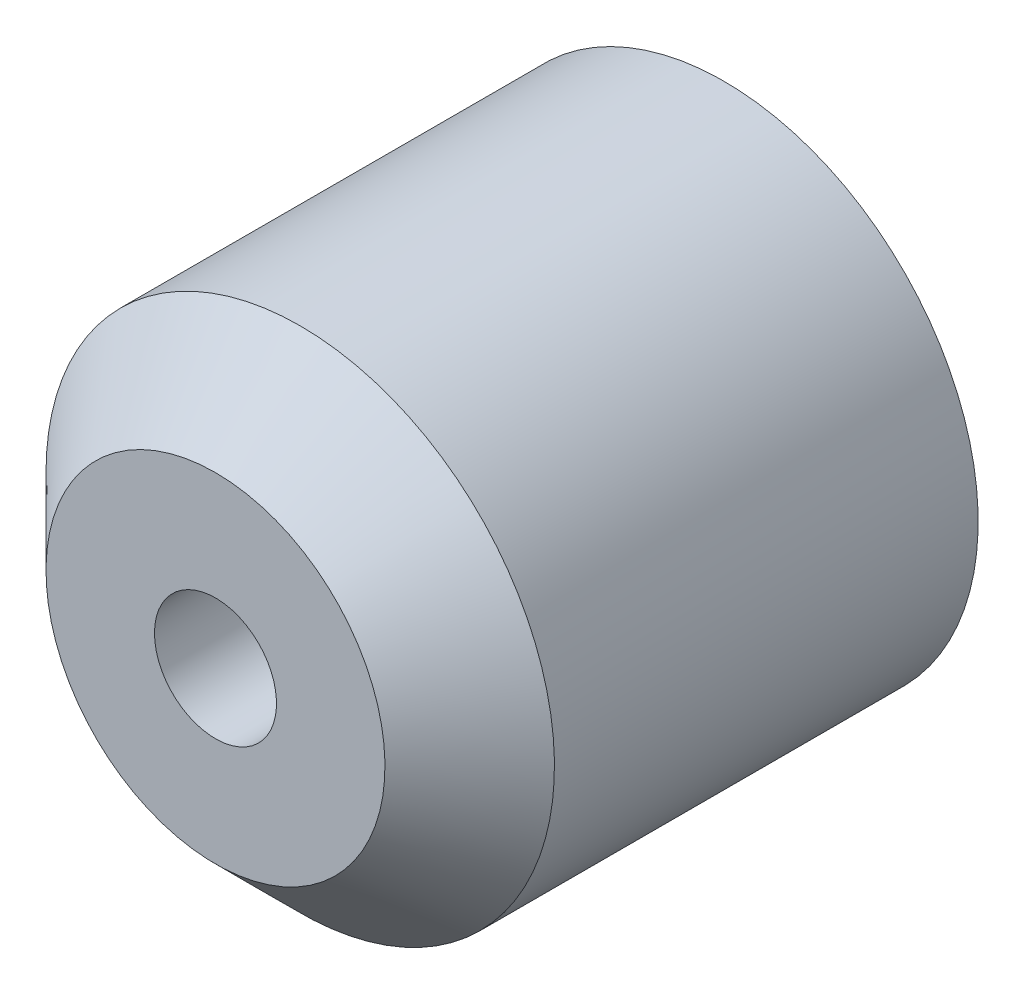
ISO-10303-21;
HEADER;
FILE_DESCRIPTION(('STEP AP214'),'2;1');
FILE_NAME('part.step','',(''),(''),'','','');
FILE_SCHEMA(('AUTOMOTIVE_DESIGN { 1 0 10303 214 1 1 1 1 }'));
ENDSEC;
DATA;
#1=APPLICATION_CONTEXT('core data for automotive mechanical design processes');
#2=APPLICATION_PROTOCOL_DEFINITION('international standard','automotive_design',2000,#1);
#3=PRODUCT_CONTEXT('',#1,'mechanical');
#4=PRODUCT('Part','Part','',(#3));
#5=PRODUCT_RELATED_PRODUCT_CATEGORY('part','',(#4));
#6=PRODUCT_DEFINITION_FORMATION('','',#4);
#7=PRODUCT_DEFINITION_CONTEXT('part definition',#1,'design');
#8=PRODUCT_DEFINITION('design','',#6,#7);
#9=PRODUCT_DEFINITION_SHAPE('','',#8);
#10=(LENGTH_UNIT() NAMED_UNIT(*) SI_UNIT(.MILLI.,.METRE.));
#11=(NAMED_UNIT(*) PLANE_ANGLE_UNIT() SI_UNIT($,.RADIAN.));
#12=(NAMED_UNIT(*) SI_UNIT($,.STERADIAN.) SOLID_ANGLE_UNIT());
#13=UNCERTAINTY_MEASURE_WITH_UNIT(LENGTH_MEASURE(1.E-05),#10,'distance_accuracy_value','');
#14=(GEOMETRIC_REPRESENTATION_CONTEXT(3) GLOBAL_UNCERTAINTY_ASSIGNED_CONTEXT((#13)) GLOBAL_UNIT_ASSIGNED_CONTEXT((#10,
#11,#12)) REPRESENTATION_CONTEXT('',''));
#15=CARTESIAN_POINT('',(0.,0.,0.));
#16=DIRECTION('',(0.,0.,1.));
#17=DIRECTION('',(1.,0.,0.));
#18=AXIS2_PLACEMENT_3D('',#15,#16,#17);
#19=CARTESIAN_POINT('',(0.,0.,0.));
#20=DIRECTION('',(0.,0.,-1.));
#21=DIRECTION('',(-1.,0.,0.));
#22=AXIS2_PLACEMENT_3D('',#19,#20,#21);
#23=CYLINDRICAL_SURFACE('',#22,2.286);
#24=CARTESIAN_POINT('',(0.,0.,0.));
#25=DIRECTION('',(0.,0.,-1.));
#26=DIRECTION('',(-1.,0.,0.));
#27=AXIS2_PLACEMENT_3D('',#24,#25,#26);
#28=CIRCLE('',#27,2.286);
#29=CARTESIAN_POINT('',(-2.286,0.,0.));
#30=VERTEX_POINT('',#29);
#31=EDGE_CURVE('E17',#30,#30,#28,.F.);
#32=ORIENTED_EDGE('',*,*,#31,.T.);
#33=EDGE_LOOP('',(#32));
#34=FACE_BOUND('',#33,.T.);
#35=CARTESIAN_POINT('',(0.,0.,-16.2052000001154));
#36=DIRECTION('',(0.,0.,-1.));
#37=DIRECTION('',(-1.,0.,0.));
#38=AXIS2_PLACEMENT_3D('',#35,#36,#37);
#39=CIRCLE('',#38,2.28600000002643);
#40=CARTESIAN_POINT('',(-2.28600000002643,0.,-16.2052000001154));
#41=VERTEX_POINT('',#40);
#42=EDGE_CURVE('E31',#41,#41,#39,.T.);
#43=ORIENTED_EDGE('',*,*,#42,.T.);
#44=EDGE_LOOP('',(#43));
#45=FACE_BOUND('',#44,.T.);
#46=ADVANCED_FACE('F14',(#34,#45),#23,.F.);
#47=CARTESIAN_POINT('',(0.,0.,-19.0499999999361));
#48=DIRECTION('',(0.,0.,-1.));
#49=DIRECTION('',(-1.,0.,0.));
#50=AXIS2_PLACEMENT_3D('',#47,#48,#49);
#51=CONICAL_SURFACE('',#50,4.55929999992577,0.67419627997474);
#52=CARTESIAN_POINT('',(0.,0.,-19.0499999999361));
#53=DIRECTION('',(0.,0.,-1.));
#54=DIRECTION('',(-1.,0.,0.));
#55=AXIS2_PLACEMENT_3D('',#52,#53,#54);
#56=CIRCLE('',#55,4.55929999992577);
#57=CARTESIAN_POINT('',(-4.55929999992577,0.,-19.0499999999361));
#58=VERTEX_POINT('',#57);
#59=EDGE_CURVE('E37',#58,#58,#56,.F.);
#60=ORIENTED_EDGE('',*,*,#59,.F.);
#61=EDGE_LOOP('',(#60));
#62=FACE_BOUND('',#61,.T.);
#63=ORIENTED_EDGE('',*,*,#42,.F.);
#64=EDGE_LOOP('',(#63));
#65=FACE_BOUND('',#64,.T.);
#66=ADVANCED_FACE('F50',(#62,#65),#51,.F.);
#67=CARTESIAN_POINT('',(0.,0.,0.));
#68=DIRECTION('',(0.,0.,-1.));
#69=DIRECTION('',(-1.,0.,0.));
#70=AXIS2_PLACEMENT_3D('',#67,#68,#69);
#71=PLANE('',#70);
#72=ORIENTED_EDGE('',*,*,#31,.F.);
#73=EDGE_LOOP('',(#72));
#74=FACE_BOUND('',#73,.T.);
#75=CARTESIAN_POINT('',(0.,0.,-3.56268833878737E-12));
#76=DIRECTION('',(0.,0.,-1.));
#77=DIRECTION('',(0.,1.,0.));
#78=AXIS2_PLACEMENT_3D('',#75,#76,#77);
#79=CIRCLE('',#78,6.34999999999602);
#80=CARTESIAN_POINT('',(0.,6.34999999999602,-3.5625437784977E-12));
#81=VERTEX_POINT('',#80);
#82=EDGE_CURVE('E26',#81,#81,#79,.T.);
#83=ORIENTED_EDGE('',*,*,#82,.F.);
#84=EDGE_LOOP('',(#83));
#85=FACE_BOUND('',#84,.T.);
#86=ADVANCED_FACE('F46',(#74,#85),#71,.F.);
#87=CARTESIAN_POINT('',(0.,0.,-19.05));
#88=DIRECTION('',(0.,0.,-1.));
#89=DIRECTION('',(-1.,0.,0.));
#90=AXIS2_PLACEMENT_3D('',#87,#88,#89);
#91=PLANE('',#90);
#92=ORIENTED_EDGE('',*,*,#59,.T.);
#93=EDGE_LOOP('',(#92));
#94=FACE_BOUND('',#93,.T.);
#95=CARTESIAN_POINT('',(0.,0.,-19.05));
#96=DIRECTION('',(0.,0.,-1.));
#97=DIRECTION('',(-1.,0.,0.));
#98=AXIS2_PLACEMENT_3D('',#95,#96,#97);
#99=CIRCLE('',#98,9.525);
#100=CARTESIAN_POINT('',(-9.525,0.,-19.05));
#101=VERTEX_POINT('',#100);
#102=EDGE_CURVE('E21',#101,#101,#99,.F.);
#103=ORIENTED_EDGE('',*,*,#102,.F.);
#104=EDGE_LOOP('',(#103));
#105=FACE_BOUND('',#104,.T.);
#106=ADVANCED_FACE('F49',(#94,#105),#91,.T.);
#107=CARTESIAN_POINT('',(0.,0.,-3.17499999999623));
#108=DIRECTION('',(0.,0.,-1.));
#109=DIRECTION('',(0.,1.,0.));
#110=AXIS2_PLACEMENT_3D('',#107,#108,#109);
#111=CONICAL_SURFACE('',#110,9.52500000000377,0.785398163399826);
#112=CARTESIAN_POINT('',(0.,0.,-3.175));
#113=DIRECTION('',(0.,0.,-1.));
#114=DIRECTION('',(-1.,0.,0.));
#115=AXIS2_PLACEMENT_3D('',#112,#113,#114);
#116=CIRCLE('',#115,9.525);
#117=CARTESIAN_POINT('',(-9.525,0.,-3.175));
#118=VERTEX_POINT('',#117);
#119=EDGE_CURVE('E10',#118,#118,#116,.T.);
#120=ORIENTED_EDGE('',*,*,#119,.F.);
#121=EDGE_LOOP('',(#120));
#122=FACE_BOUND('',#121,.T.);
#123=ORIENTED_EDGE('',*,*,#82,.T.);
#124=EDGE_LOOP('',(#123));
#125=FACE_BOUND('',#124,.T.);
#126=ADVANCED_FACE('F54',(#122,#125),#111,.T.);
#127=CARTESIAN_POINT('',(0.,0.,0.));
#128=DIRECTION('',(0.,0.,-1.));
#129=DIRECTION('',(-1.,0.,0.));
#130=AXIS2_PLACEMENT_3D('',#127,#128,#129);
#131=CYLINDRICAL_SURFACE('',#130,9.525);
#132=ORIENTED_EDGE('',*,*,#119,.T.);
#133=EDGE_LOOP('',(#132));
#134=FACE_BOUND('',#133,.T.);
#135=ORIENTED_EDGE('',*,*,#102,.T.);
#136=EDGE_LOOP('',(#135));
#137=FACE_BOUND('',#136,.T.);
#138=ADVANCED_FACE('F56',(#134,#137),#131,.T.);
#139=CLOSED_SHELL('',(#46,#66,#86,#106,#126,#138));
#140=MANIFOLD_SOLID_BREP('B1',#139);
#141=ADVANCED_BREP_SHAPE_REPRESENTATION('',(#18,#140),#14);
#142=SHAPE_DEFINITION_REPRESENTATION(#9,#141);
ENDSEC;
END-ISO-10303-21;
